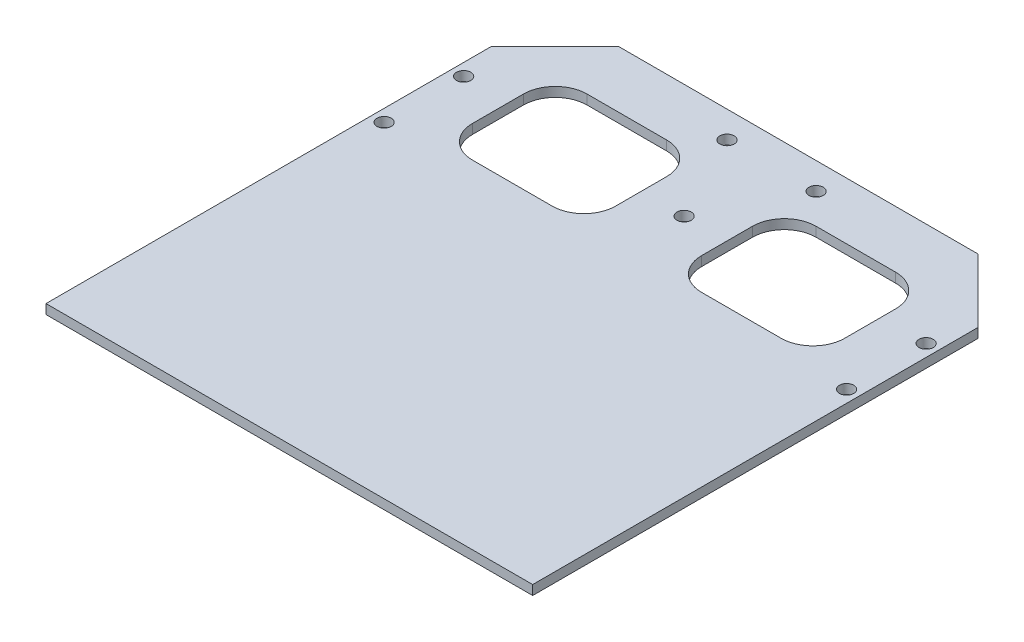
ISO-10303-21;
HEADER;
FILE_DESCRIPTION(('STEP AP214'),'2;1');
FILE_NAME('part.step','',(''),(''),'','','');
FILE_SCHEMA(('AUTOMOTIVE_DESIGN { 1 0 10303 214 1 1 1 1 }'));
ENDSEC;
DATA;
#1=APPLICATION_CONTEXT('core data for automotive mechanical design processes');
#2=APPLICATION_PROTOCOL_DEFINITION('international standard','automotive_design',2000,#1);
#3=PRODUCT_CONTEXT('',#1,'mechanical');
#4=PRODUCT('Part','Part','',(#3));
#5=PRODUCT_RELATED_PRODUCT_CATEGORY('part','',(#4));
#6=PRODUCT_DEFINITION_FORMATION('','',#4);
#7=PRODUCT_DEFINITION_CONTEXT('part definition',#1,'design');
#8=PRODUCT_DEFINITION('design','',#6,#7);
#9=PRODUCT_DEFINITION_SHAPE('','',#8);
#10=(LENGTH_UNIT() NAMED_UNIT(*) SI_UNIT(.MILLI.,.METRE.));
#11=(NAMED_UNIT(*) PLANE_ANGLE_UNIT() SI_UNIT($,.RADIAN.));
#12=(NAMED_UNIT(*) SI_UNIT($,.STERADIAN.) SOLID_ANGLE_UNIT());
#13=UNCERTAINTY_MEASURE_WITH_UNIT(LENGTH_MEASURE(1.E-05),#10,'distance_accuracy_value','');
#14=(GEOMETRIC_REPRESENTATION_CONTEXT(3) GLOBAL_UNCERTAINTY_ASSIGNED_CONTEXT((#13)) GLOBAL_UNIT_ASSIGNED_CONTEXT((#10,
#11,#12)) REPRESENTATION_CONTEXT('',''));
#15=CARTESIAN_POINT('',(0.,0.,0.));
#16=DIRECTION('',(0.,0.,1.));
#17=DIRECTION('',(1.,0.,0.));
#18=AXIS2_PLACEMENT_3D('',#15,#16,#17);
#19=CARTESIAN_POINT('',(76.5,3.,-80.));
#20=DIRECTION('',(-1.,0.,0.));
#21=DIRECTION('',(0.,0.,1.));
#22=AXIS2_PLACEMENT_3D('',#19,#20,#21);
#23=PLANE('',#22);
#24=DIRECTION('',(0.,0.,-1.));
#25=VECTOR('',#24,1.);
#26=CARTESIAN_POINT('',(76.5,0.,-80.));
#27=LINE('',#26,#25);
#28=CARTESIAN_POINT('',(76.5,0.,80.));
#29=VERTEX_POINT('',#28);
#30=CARTESIAN_POINT('',(76.5,0.,-59.9999999999999));
#31=VERTEX_POINT('',#30);
#32=EDGE_CURVE('E222',#29,#31,#27,.T.);
#33=ORIENTED_EDGE('',*,*,#32,.T.);
#34=DIRECTION('',(0.,1.,0.));
#35=VECTOR('',#34,1.);
#36=CARTESIAN_POINT('',(76.5,3.,-59.9999999999999));
#37=LINE('',#36,#35);
#38=CARTESIAN_POINT('',(76.5,3.,-59.9999999999999));
#39=VERTEX_POINT('',#38);
#40=EDGE_CURVE('E66',#31,#39,#37,.T.);
#41=ORIENTED_EDGE('',*,*,#40,.T.);
#42=DIRECTION('',(0.,0.,-1.));
#43=VECTOR('',#42,1.);
#44=CARTESIAN_POINT('',(76.5,3.,-80.));
#45=LINE('',#44,#43);
#46=CARTESIAN_POINT('',(76.5,3.,80.));
#47=VERTEX_POINT('',#46);
#48=EDGE_CURVE('E234',#47,#39,#45,.T.);
#49=ORIENTED_EDGE('',*,*,#48,.F.);
#50=DIRECTION('',(0.,-1.,0.));
#51=VECTOR('',#50,1.);
#52=CARTESIAN_POINT('',(76.5,3.,80.));
#53=LINE('',#52,#51);
#54=EDGE_CURVE('E212',#47,#29,#53,.T.);
#55=ORIENTED_EDGE('',*,*,#54,.T.);
#56=EDGE_LOOP('',(#33,#41,#49,#55));
#57=FACE_BOUND('',#56,.T.);
#58=ADVANCED_FACE('F41',(#57),#23,.F.);
#59=CARTESIAN_POINT('',(-76.5,3.,-80.));
#60=DIRECTION('',(0.,0.,1.));
#61=DIRECTION('',(1.,0.,0.));
#62=AXIS2_PLACEMENT_3D('',#59,#60,#61);
#63=PLANE('',#62);
#64=DIRECTION('',(-1.,0.,0.));
#65=VECTOR('',#64,1.);
#66=CARTESIAN_POINT('',(-76.5,3.,-80.));
#67=LINE('',#66,#65);
#68=CARTESIAN_POINT('',(56.5,3.,-80.));
#69=VERTEX_POINT('',#68);
#70=CARTESIAN_POINT('',(-56.4999999999999,3.,-80.));
#71=VERTEX_POINT('',#70);
#72=EDGE_CURVE('E201',#69,#71,#67,.T.);
#73=ORIENTED_EDGE('',*,*,#72,.F.);
#74=DIRECTION('',(0.,-1.,0.));
#75=VECTOR('',#74,1.);
#76=CARTESIAN_POINT('',(56.5,3.,-80.));
#77=LINE('',#76,#75);
#78=CARTESIAN_POINT('',(56.5,0.,-80.));
#79=VERTEX_POINT('',#78);
#80=EDGE_CURVE('E402',#69,#79,#77,.T.);
#81=ORIENTED_EDGE('',*,*,#80,.T.);
#82=DIRECTION('',(-1.,0.,0.));
#83=VECTOR('',#82,1.);
#84=CARTESIAN_POINT('',(-76.5,0.,-80.));
#85=LINE('',#84,#83);
#86=CARTESIAN_POINT('',(-56.4999999999999,0.,-80.));
#87=VERTEX_POINT('',#86);
#88=EDGE_CURVE('E225',#79,#87,#85,.T.);
#89=ORIENTED_EDGE('',*,*,#88,.T.);
#90=DIRECTION('',(0.,1.,0.));
#91=VECTOR('',#90,1.);
#92=CARTESIAN_POINT('',(-56.4999999999999,3.,-80.));
#93=LINE('',#92,#91);
#94=EDGE_CURVE('E399',#87,#71,#93,.T.);
#95=ORIENTED_EDGE('',*,*,#94,.T.);
#96=EDGE_LOOP('',(#73,#81,#89,#95));
#97=FACE_BOUND('',#96,.T.);
#98=ADVANCED_FACE('F421',(#97),#63,.F.);
#99=CARTESIAN_POINT('',(-76.5,3.,-80.));
#100=DIRECTION('',(1.,0.,0.));
#101=DIRECTION('',(0.,0.,-1.));
#102=AXIS2_PLACEMENT_3D('',#99,#100,#101);
#103=PLANE('',#102);
#104=DIRECTION('',(0.,0.,1.));
#105=VECTOR('',#104,1.);
#106=CARTESIAN_POINT('',(-76.5,3.,-80.));
#107=LINE('',#106,#105);
#108=CARTESIAN_POINT('',(-76.5,3.,-60.));
#109=VERTEX_POINT('',#108);
#110=CARTESIAN_POINT('',(-76.5,3.,80.));
#111=VERTEX_POINT('',#110);
#112=EDGE_CURVE('E192',#109,#111,#107,.T.);
#113=ORIENTED_EDGE('',*,*,#112,.F.);
#114=DIRECTION('',(0.,-1.,0.));
#115=VECTOR('',#114,1.);
#116=CARTESIAN_POINT('',(-76.5,3.,-60.));
#117=LINE('',#116,#115);
#118=CARTESIAN_POINT('',(-76.5,0.,-60.));
#119=VERTEX_POINT('',#118);
#120=EDGE_CURVE('E11',#109,#119,#117,.T.);
#121=ORIENTED_EDGE('',*,*,#120,.T.);
#122=DIRECTION('',(0.,0.,1.));
#123=VECTOR('',#122,1.);
#124=CARTESIAN_POINT('',(-76.5,0.,-80.));
#125=LINE('',#124,#123);
#126=CARTESIAN_POINT('',(-76.5,0.,80.));
#127=VERTEX_POINT('',#126);
#128=EDGE_CURVE('E207',#119,#127,#125,.T.);
#129=ORIENTED_EDGE('',*,*,#128,.T.);
#130=DIRECTION('',(0.,-1.,0.));
#131=VECTOR('',#130,1.);
#132=CARTESIAN_POINT('',(-76.5,3.,80.));
#133=LINE('',#132,#131);
#134=EDGE_CURVE('E204',#111,#127,#133,.T.);
#135=ORIENTED_EDGE('',*,*,#134,.F.);
#136=EDGE_LOOP('',(#113,#121,#129,#135));
#137=FACE_BOUND('',#136,.T.);
#138=ADVANCED_FACE('F205',(#137),#103,.F.);
#139=CARTESIAN_POINT('',(-76.5,3.,80.));
#140=DIRECTION('',(0.,0.,-1.));
#141=DIRECTION('',(-1.,0.,0.));
#142=AXIS2_PLACEMENT_3D('',#139,#140,#141);
#143=PLANE('',#142);
#144=DIRECTION('',(1.,0.,0.));
#145=VECTOR('',#144,1.);
#146=CARTESIAN_POINT('',(-76.5,0.,80.));
#147=LINE('',#146,#145);
#148=EDGE_CURVE('E232',#127,#29,#147,.T.);
#149=ORIENTED_EDGE('',*,*,#148,.T.);
#150=ORIENTED_EDGE('',*,*,#54,.F.);
#151=DIRECTION('',(1.,0.,0.));
#152=VECTOR('',#151,1.);
#153=CARTESIAN_POINT('',(-76.5,3.,80.));
#154=LINE('',#153,#152);
#155=EDGE_CURVE('E196',#111,#47,#154,.T.);
#156=ORIENTED_EDGE('',*,*,#155,.F.);
#157=ORIENTED_EDGE('',*,*,#134,.T.);
#158=EDGE_LOOP('',(#149,#150,#156,#157));
#159=FACE_BOUND('',#158,.T.);
#160=ADVANCED_FACE('F214',(#159),#143,.F.);
#161=CARTESIAN_POINT('',(0.,3.,0.));
#162=DIRECTION('',(0.,1.,0.));
#163=DIRECTION('',(0.,0.,1.));
#164=AXIS2_PLACEMENT_3D('',#161,#162,#163);
#165=PLANE('',#164);
#166=DIRECTION('',(0.,0.,-1.));
#167=VECTOR('',#166,1.);
#168=CARTESIAN_POINT('',(58.5,3.,-62.1));
#169=LINE('',#168,#167);
#170=CARTESIAN_POINT('',(58.5,3.,-36.1));
#171=VERTEX_POINT('',#170);
#172=CARTESIAN_POINT('',(58.5,3.,-52.1));
#173=VERTEX_POINT('',#172);
#174=EDGE_CURVE('E464',#171,#173,#169,.T.);
#175=ORIENTED_EDGE('',*,*,#174,.F.);
#176=CARTESIAN_POINT('',(48.5,3.,-36.1));
#177=DIRECTION('',(0.,1.,0.));
#178=DIRECTION('',(0.,0.,1.));
#179=AXIS2_PLACEMENT_3D('',#176,#177,#178);
#180=CIRCLE('',#179,10.);
#181=CARTESIAN_POINT('',(48.5,3.,-26.1));
#182=VERTEX_POINT('',#181);
#183=EDGE_CURVE('E351',#171,#182,#180,.F.);
#184=ORIENTED_EDGE('',*,*,#183,.T.);
#185=DIRECTION('',(1.,0.,0.));
#186=VECTOR('',#185,1.);
#187=CARTESIAN_POINT('',(13.5,3.,-26.1));
#188=LINE('',#187,#186);
#189=CARTESIAN_POINT('',(23.5,3.,-26.1));
#190=VERTEX_POINT('',#189);
#191=EDGE_CURVE('E456',#190,#182,#188,.T.);
#192=ORIENTED_EDGE('',*,*,#191,.F.);
#193=CARTESIAN_POINT('',(23.5,3.,-36.1));
#194=DIRECTION('',(0.,1.,0.));
#195=DIRECTION('',(0.,0.,1.));
#196=AXIS2_PLACEMENT_3D('',#193,#194,#195);
#197=CIRCLE('',#196,10.);
#198=CARTESIAN_POINT('',(13.5,3.,-36.1));
#199=VERTEX_POINT('',#198);
#200=EDGE_CURVE('E357',#190,#199,#197,.F.);
#201=ORIENTED_EDGE('',*,*,#200,.T.);
#202=DIRECTION('',(0.,0.,1.));
#203=VECTOR('',#202,1.);
#204=CARTESIAN_POINT('',(13.5,3.,-62.1));
#205=LINE('',#204,#203);
#206=CARTESIAN_POINT('',(13.5,3.,-52.1));
#207=VERTEX_POINT('',#206);
#208=EDGE_CURVE('E480',#207,#199,#205,.T.);
#209=ORIENTED_EDGE('',*,*,#208,.F.);
#210=CARTESIAN_POINT('',(23.5,3.,-52.1));
#211=DIRECTION('',(0.,1.,0.));
#212=DIRECTION('',(0.,0.,1.));
#213=AXIS2_PLACEMENT_3D('',#210,#211,#212);
#214=CIRCLE('',#213,10.);
#215=CARTESIAN_POINT('',(23.5,3.,-62.1));
#216=VERTEX_POINT('',#215);
#217=EDGE_CURVE('E363',#207,#216,#214,.F.);
#218=ORIENTED_EDGE('',*,*,#217,.T.);
#219=DIRECTION('',(-1.,0.,0.));
#220=VECTOR('',#219,1.);
#221=CARTESIAN_POINT('',(13.5,3.,-62.1));
#222=LINE('',#221,#220);
#223=CARTESIAN_POINT('',(48.5,3.,-62.1));
#224=VERTEX_POINT('',#223);
#225=EDGE_CURVE('E484',#224,#216,#222,.T.);
#226=ORIENTED_EDGE('',*,*,#225,.F.);
#227=CARTESIAN_POINT('',(48.5,3.,-52.1));
#228=DIRECTION('',(0.,1.,0.));
#229=DIRECTION('',(0.,0.,1.));
#230=AXIS2_PLACEMENT_3D('',#227,#228,#229);
#231=CIRCLE('',#230,10.);
#232=EDGE_CURVE('E369',#224,#173,#231,.F.);
#233=ORIENTED_EDGE('',*,*,#232,.T.);
#234=EDGE_LOOP('',(#175,#184,#192,#201,#209,#218,#226,#233));
#235=FACE_BOUND('',#234,.T.);
#236=DIRECTION('',(-1.,0.,0.));
#237=VECTOR('',#236,1.);
#238=CARTESIAN_POINT('',(-13.5,3.,-62.1));
#239=LINE('',#238,#237);
#240=CARTESIAN_POINT('',(-23.5,3.,-62.1));
#241=VERTEX_POINT('',#240);
#242=CARTESIAN_POINT('',(-48.5,3.,-62.1));
#243=VERTEX_POINT('',#242);
#244=EDGE_CURVE('E473',#241,#243,#239,.T.);
#245=ORIENTED_EDGE('',*,*,#244,.F.);
#246=CARTESIAN_POINT('',(-23.5,3.,-52.1));
#247=DIRECTION('',(0.,1.,0.));
#248=DIRECTION('',(0.,0.,1.));
#249=AXIS2_PLACEMENT_3D('',#246,#247,#248);
#250=CIRCLE('',#249,10.);
#251=CARTESIAN_POINT('',(-13.5,3.,-52.1));
#252=VERTEX_POINT('',#251);
#253=EDGE_CURVE('E393',#241,#252,#250,.F.);
#254=ORIENTED_EDGE('',*,*,#253,.T.);
#255=DIRECTION('',(0.,0.,-1.));
#256=VECTOR('',#255,1.);
#257=CARTESIAN_POINT('',(-13.5,3.,-62.1));
#258=LINE('',#257,#256);
#259=CARTESIAN_POINT('',(-13.5,3.,-36.1));
#260=VERTEX_POINT('',#259);
#261=EDGE_CURVE('E460',#260,#252,#258,.T.);
#262=ORIENTED_EDGE('',*,*,#261,.F.);
#263=CARTESIAN_POINT('',(-23.5,3.,-36.1));
#264=DIRECTION('',(0.,1.,0.));
#265=DIRECTION('',(0.,0.,1.));
#266=AXIS2_PLACEMENT_3D('',#263,#264,#265);
#267=CIRCLE('',#266,10.);
#268=CARTESIAN_POINT('',(-23.5,3.,-26.1));
#269=VERTEX_POINT('',#268);
#270=EDGE_CURVE('E375',#260,#269,#267,.F.);
#271=ORIENTED_EDGE('',*,*,#270,.T.);
#272=DIRECTION('',(1.,0.,0.));
#273=VECTOR('',#272,1.);
#274=CARTESIAN_POINT('',(-13.5,3.,-26.1));
#275=LINE('',#274,#273);
#276=CARTESIAN_POINT('',(-48.5,3.,-26.1));
#277=VERTEX_POINT('',#276);
#278=EDGE_CURVE('E465',#277,#269,#275,.T.);
#279=ORIENTED_EDGE('',*,*,#278,.F.);
#280=CARTESIAN_POINT('',(-48.5,3.,-36.1));
#281=DIRECTION('',(0.,1.,0.));
#282=DIRECTION('',(0.,0.,1.));
#283=AXIS2_PLACEMENT_3D('',#280,#281,#282);
#284=CIRCLE('',#283,10.);
#285=CARTESIAN_POINT('',(-58.5,3.,-36.1));
#286=VERTEX_POINT('',#285);
#287=EDGE_CURVE('E381',#277,#286,#284,.F.);
#288=ORIENTED_EDGE('',*,*,#287,.T.);
#289=DIRECTION('',(0.,0.,1.));
#290=VECTOR('',#289,1.);
#291=CARTESIAN_POINT('',(-58.5,3.,-62.1));
#292=LINE('',#291,#290);
#293=CARTESIAN_POINT('',(-58.5,3.,-52.1));
#294=VERTEX_POINT('',#293);
#295=EDGE_CURVE('E469',#294,#286,#292,.T.);
#296=ORIENTED_EDGE('',*,*,#295,.F.);
#297=CARTESIAN_POINT('',(-48.5,3.,-52.1));
#298=DIRECTION('',(0.,1.,0.));
#299=DIRECTION('',(0.,0.,1.));
#300=AXIS2_PLACEMENT_3D('',#297,#298,#299);
#301=CIRCLE('',#300,10.);
#302=EDGE_CURVE('E387',#294,#243,#301,.F.);
#303=ORIENTED_EDGE('',*,*,#302,.T.);
#304=EDGE_LOOP('',(#245,#254,#262,#271,#279,#288,#296,#303));
#305=FACE_BOUND('',#304,.T.);
#306=CARTESIAN_POINT('',(-14.,3.,-71.6));
#307=DIRECTION('',(0.,1.,0.));
#308=DIRECTION('',(0.,0.,1.));
#309=AXIS2_PLACEMENT_3D('',#306,#307,#308);
#310=CIRCLE('',#309,2.25);
#311=CARTESIAN_POINT('',(-14.,3.,-69.35));
#312=VERTEX_POINT('',#311);
#313=EDGE_CURVE('E444',#312,#312,#310,.T.);
#314=ORIENTED_EDGE('',*,*,#313,.F.);
#315=EDGE_LOOP('',(#314));
#316=FACE_BOUND('',#315,.T.);
#317=CARTESIAN_POINT('',(-72.7,3.,-22.5));
#318=DIRECTION('',(0.,1.,0.));
#319=DIRECTION('',(0.,0.,-1.));
#320=AXIS2_PLACEMENT_3D('',#317,#318,#319);
#321=CIRCLE('',#320,2.25);
#322=CARTESIAN_POINT('',(-72.7,3.,-24.7499999999999));
#323=VERTEX_POINT('',#322);
#324=EDGE_CURVE('E440',#323,#323,#321,.T.);
#325=ORIENTED_EDGE('',*,*,#324,.F.);
#326=EDGE_LOOP('',(#325));
#327=FACE_BOUND('',#326,.T.);
#328=CARTESIAN_POINT('',(72.7,3.,-22.5));
#329=DIRECTION('',(0.,1.,0.));
#330=DIRECTION('',(0.,0.,1.));
#331=AXIS2_PLACEMENT_3D('',#328,#329,#330);
#332=CIRCLE('',#331,2.25);
#333=CARTESIAN_POINT('',(72.7,3.,-20.25));
#334=VERTEX_POINT('',#333);
#335=EDGE_CURVE('E436',#334,#334,#332,.T.);
#336=ORIENTED_EDGE('',*,*,#335,.F.);
#337=EDGE_LOOP('',(#336));
#338=FACE_BOUND('',#337,.T.);
#339=CARTESIAN_POINT('',(-72.7,3.,-47.5));
#340=DIRECTION('',(0.,1.,0.));
#341=DIRECTION('',(0.,0.,-1.));
#342=AXIS2_PLACEMENT_3D('',#339,#340,#341);
#343=CIRCLE('',#342,2.25);
#344=CARTESIAN_POINT('',(-72.7,3.,-49.75));
#345=VERTEX_POINT('',#344);
#346=EDGE_CURVE('E435',#345,#345,#343,.T.);
#347=ORIENTED_EDGE('',*,*,#346,.F.);
#348=EDGE_LOOP('',(#347));
#349=FACE_BOUND('',#348,.T.);
#350=CARTESIAN_POINT('',(14.,3.,-71.6));
#351=DIRECTION('',(0.,1.,0.));
#352=DIRECTION('',(0.,0.,-1.));
#353=AXIS2_PLACEMENT_3D('',#350,#351,#352);
#354=CIRCLE('',#353,2.25);
#355=CARTESIAN_POINT('',(14.,3.,-73.85));
#356=VERTEX_POINT('',#355);
#357=EDGE_CURVE('E448',#356,#356,#354,.T.);
#358=ORIENTED_EDGE('',*,*,#357,.F.);
#359=EDGE_LOOP('',(#358));
#360=FACE_BOUND('',#359,.T.);
#361=CARTESIAN_POINT('',(0.,3.,-44.1));
#362=DIRECTION('',(0.,1.,0.));
#363=DIRECTION('',(0.,0.,1.));
#364=AXIS2_PLACEMENT_3D('',#361,#362,#363);
#365=CIRCLE('',#364,2.25);
#366=CARTESIAN_POINT('',(0.,3.,-41.85));
#367=VERTEX_POINT('',#366);
#368=EDGE_CURVE('E452',#367,#367,#365,.T.);
#369=ORIENTED_EDGE('',*,*,#368,.F.);
#370=EDGE_LOOP('',(#369));
#371=FACE_BOUND('',#370,.T.);
#372=CARTESIAN_POINT('',(72.7,3.,-47.5));
#373=DIRECTION('',(0.,1.,0.));
#374=DIRECTION('',(0.,0.,1.));
#375=AXIS2_PLACEMENT_3D('',#372,#373,#374);
#376=CIRCLE('',#375,2.25);
#377=CARTESIAN_POINT('',(72.7,3.,-45.25));
#378=VERTEX_POINT('',#377);
#379=EDGE_CURVE('E241',#378,#378,#376,.T.);
#380=ORIENTED_EDGE('',*,*,#379,.F.);
#381=EDGE_LOOP('',(#380));
#382=FACE_BOUND('',#381,.T.);
#383=ORIENTED_EDGE('',*,*,#48,.T.);
#384=DIRECTION('',(0.707106781186547,0.,0.707106781186549));
#385=VECTOR('',#384,1.);
#386=CARTESIAN_POINT('',(68.2500000000001,3.,-68.2499999999999));
#387=LINE('',#386,#385);
#388=EDGE_CURVE('E51',#39,#69,#387,.F.);
#389=ORIENTED_EDGE('',*,*,#388,.T.);
#390=ORIENTED_EDGE('',*,*,#72,.T.);
#391=DIRECTION('',(0.707106781186549,0.,-0.707106781186547));
#392=VECTOR('',#391,1.);
#393=CARTESIAN_POINT('',(-68.2499999999999,3.,-68.2500000000001));
#394=LINE('',#393,#392);
#395=EDGE_CURVE('E58',#71,#109,#394,.F.);
#396=ORIENTED_EDGE('',*,*,#395,.T.);
#397=ORIENTED_EDGE('',*,*,#112,.T.);
#398=ORIENTED_EDGE('',*,*,#155,.T.);
#399=EDGE_LOOP('',(#383,#389,#390,#396,#397,#398));
#400=FACE_BOUND('',#399,.T.);
#401=ADVANCED_FACE('F194',(#235,#305,#316,#327,#338,#349,#360,#371,#382,#400),#165,.T.);
#402=CARTESIAN_POINT('',(0.,0.,0.));
#403=DIRECTION('',(0.,1.,0.));
#404=DIRECTION('',(0.,0.,1.));
#405=AXIS2_PLACEMENT_3D('',#402,#403,#404);
#406=PLANE('',#405);
#407=DIRECTION('',(0.,0.,1.));
#408=VECTOR('',#407,1.);
#409=CARTESIAN_POINT('',(13.5,0.,0.));
#410=LINE('',#409,#408);
#411=CARTESIAN_POINT('',(13.5,0.,-52.1));
#412=VERTEX_POINT('',#411);
#413=CARTESIAN_POINT('',(13.5,0.,-36.1));
#414=VERTEX_POINT('',#413);
#415=EDGE_CURVE('E283',#412,#414,#410,.T.);
#416=ORIENTED_EDGE('',*,*,#415,.T.);
#417=CARTESIAN_POINT('',(23.5,0.,-36.1));
#418=DIRECTION('',(0.,1.,0.));
#419=DIRECTION('',(0.,0.,1.));
#420=AXIS2_PLACEMENT_3D('',#417,#418,#419);
#421=CIRCLE('',#420,10.);
#422=CARTESIAN_POINT('',(23.5,0.,-26.1));
#423=VERTEX_POINT('',#422);
#424=EDGE_CURVE('E360',#414,#423,#421,.T.);
#425=ORIENTED_EDGE('',*,*,#424,.T.);
#426=DIRECTION('',(1.,0.,0.));
#427=VECTOR('',#426,1.);
#428=CARTESIAN_POINT('',(0.,0.,-26.1));
#429=LINE('',#428,#427);
#430=CARTESIAN_POINT('',(48.5,0.,-26.1));
#431=VERTEX_POINT('',#430);
#432=EDGE_CURVE('E287',#423,#431,#429,.T.);
#433=ORIENTED_EDGE('',*,*,#432,.T.);
#434=CARTESIAN_POINT('',(48.5,0.,-36.1));
#435=DIRECTION('',(0.,1.,0.));
#436=DIRECTION('',(0.,0.,1.));
#437=AXIS2_PLACEMENT_3D('',#434,#435,#436);
#438=CIRCLE('',#437,10.);
#439=CARTESIAN_POINT('',(58.5,0.,-36.1));
#440=VERTEX_POINT('',#439);
#441=EDGE_CURVE('E354',#431,#440,#438,.T.);
#442=ORIENTED_EDGE('',*,*,#441,.T.);
#443=DIRECTION('',(0.,0.,-1.));
#444=VECTOR('',#443,1.);
#445=CARTESIAN_POINT('',(58.5,0.,0.));
#446=LINE('',#445,#444);
#447=CARTESIAN_POINT('',(58.5,0.,-52.1));
#448=VERTEX_POINT('',#447);
#449=EDGE_CURVE('E291',#440,#448,#446,.T.);
#450=ORIENTED_EDGE('',*,*,#449,.T.);
#451=CARTESIAN_POINT('',(48.5,0.,-52.1));
#452=DIRECTION('',(0.,1.,0.));
#453=DIRECTION('',(0.,0.,1.));
#454=AXIS2_PLACEMENT_3D('',#451,#452,#453);
#455=CIRCLE('',#454,10.);
#456=CARTESIAN_POINT('',(48.5,0.,-62.1));
#457=VERTEX_POINT('',#456);
#458=EDGE_CURVE('E372',#448,#457,#455,.T.);
#459=ORIENTED_EDGE('',*,*,#458,.T.);
#460=DIRECTION('',(-1.,0.,0.));
#461=VECTOR('',#460,1.);
#462=CARTESIAN_POINT('',(0.,0.,-62.1));
#463=LINE('',#462,#461);
#464=CARTESIAN_POINT('',(23.5,0.,-62.1));
#465=VERTEX_POINT('',#464);
#466=EDGE_CURVE('E279',#457,#465,#463,.T.);
#467=ORIENTED_EDGE('',*,*,#466,.T.);
#468=CARTESIAN_POINT('',(23.5,0.,-52.1));
#469=DIRECTION('',(0.,1.,0.));
#470=DIRECTION('',(0.,0.,1.));
#471=AXIS2_PLACEMENT_3D('',#468,#469,#470);
#472=CIRCLE('',#471,10.);
#473=EDGE_CURVE('E366',#465,#412,#472,.T.);
#474=ORIENTED_EDGE('',*,*,#473,.T.);
#475=EDGE_LOOP('',(#416,#425,#433,#442,#450,#459,#467,#474));
#476=FACE_BOUND('',#475,.T.);
#477=DIRECTION('',(1.,0.,0.));
#478=VECTOR('',#477,1.);
#479=CARTESIAN_POINT('',(0.,0.,-26.1));
#480=LINE('',#479,#478);
#481=CARTESIAN_POINT('',(-48.5,0.,-26.1));
#482=VERTEX_POINT('',#481);
#483=CARTESIAN_POINT('',(-23.5,0.,-26.1));
#484=VERTEX_POINT('',#483);
#485=EDGE_CURVE('E267',#482,#484,#480,.T.);
#486=ORIENTED_EDGE('',*,*,#485,.T.);
#487=CARTESIAN_POINT('',(-23.5,0.,-36.1));
#488=DIRECTION('',(0.,1.,0.));
#489=DIRECTION('',(0.,0.,1.));
#490=AXIS2_PLACEMENT_3D('',#487,#488,#489);
#491=CIRCLE('',#490,10.);
#492=CARTESIAN_POINT('',(-13.5,0.,-36.1));
#493=VERTEX_POINT('',#492);
#494=EDGE_CURVE('E378',#484,#493,#491,.T.);
#495=ORIENTED_EDGE('',*,*,#494,.T.);
#496=DIRECTION('',(0.,0.,-1.));
#497=VECTOR('',#496,1.);
#498=CARTESIAN_POINT('',(-13.5,0.,0.));
#499=LINE('',#498,#497);
#500=CARTESIAN_POINT('',(-13.5,0.,-52.1));
#501=VERTEX_POINT('',#500);
#502=EDGE_CURVE('E271',#493,#501,#499,.T.);
#503=ORIENTED_EDGE('',*,*,#502,.T.);
#504=CARTESIAN_POINT('',(-23.5,0.,-52.1));
#505=DIRECTION('',(0.,1.,0.));
#506=DIRECTION('',(0.,0.,1.));
#507=AXIS2_PLACEMENT_3D('',#504,#505,#506);
#508=CIRCLE('',#507,10.);
#509=CARTESIAN_POINT('',(-23.5,0.,-62.1));
#510=VERTEX_POINT('',#509);
#511=EDGE_CURVE('E396',#501,#510,#508,.T.);
#512=ORIENTED_EDGE('',*,*,#511,.T.);
#513=DIRECTION('',(-1.,0.,0.));
#514=VECTOR('',#513,1.);
#515=CARTESIAN_POINT('',(0.,0.,-62.1));
#516=LINE('',#515,#514);
#517=CARTESIAN_POINT('',(-48.5,0.,-62.1));
#518=VERTEX_POINT('',#517);
#519=EDGE_CURVE('E275',#510,#518,#516,.T.);
#520=ORIENTED_EDGE('',*,*,#519,.T.);
#521=CARTESIAN_POINT('',(-48.5,0.,-52.1));
#522=DIRECTION('',(0.,1.,0.));
#523=DIRECTION('',(0.,0.,1.));
#524=AXIS2_PLACEMENT_3D('',#521,#522,#523);
#525=CIRCLE('',#524,10.);
#526=CARTESIAN_POINT('',(-58.5,0.,-52.1));
#527=VERTEX_POINT('',#526);
#528=EDGE_CURVE('E390',#518,#527,#525,.T.);
#529=ORIENTED_EDGE('',*,*,#528,.T.);
#530=DIRECTION('',(0.,0.,1.));
#531=VECTOR('',#530,1.);
#532=CARTESIAN_POINT('',(-58.5,0.,0.));
#533=LINE('',#532,#531);
#534=CARTESIAN_POINT('',(-58.5,0.,-36.1));
#535=VERTEX_POINT('',#534);
#536=EDGE_CURVE('E211',#527,#535,#533,.T.);
#537=ORIENTED_EDGE('',*,*,#536,.T.);
#538=CARTESIAN_POINT('',(-48.5,0.,-36.1));
#539=DIRECTION('',(0.,1.,0.));
#540=DIRECTION('',(0.,0.,1.));
#541=AXIS2_PLACEMENT_3D('',#538,#539,#540);
#542=CIRCLE('',#541,10.);
#543=EDGE_CURVE('E384',#535,#482,#542,.T.);
#544=ORIENTED_EDGE('',*,*,#543,.T.);
#545=EDGE_LOOP('',(#486,#495,#503,#512,#520,#529,#537,#544));
#546=FACE_BOUND('',#545,.T.);
#547=CARTESIAN_POINT('',(-14.,0.,-71.6));
#548=DIRECTION('',(0.,1.,0.));
#549=DIRECTION('',(0.,0.,1.));
#550=AXIS2_PLACEMENT_3D('',#547,#548,#549);
#551=CIRCLE('',#550,2.25);
#552=CARTESIAN_POINT('',(-14.,0.,-69.35));
#553=VERTEX_POINT('',#552);
#554=EDGE_CURVE('E226',#553,#553,#551,.T.);
#555=ORIENTED_EDGE('',*,*,#554,.T.);
#556=EDGE_LOOP('',(#555));
#557=FACE_BOUND('',#556,.T.);
#558=CARTESIAN_POINT('',(-72.7,0.,-22.5));
#559=DIRECTION('',(0.,1.,0.));
#560=DIRECTION('',(0.,0.,1.));
#561=AXIS2_PLACEMENT_3D('',#558,#559,#560);
#562=CIRCLE('',#561,2.25);
#563=CARTESIAN_POINT('',(-72.7,0.,-20.25));
#564=VERTEX_POINT('',#563);
#565=EDGE_CURVE('E257',#564,#564,#562,.T.);
#566=ORIENTED_EDGE('',*,*,#565,.T.);
#567=EDGE_LOOP('',(#566));
#568=FACE_BOUND('',#567,.T.);
#569=CARTESIAN_POINT('',(72.7,0.,-22.5));
#570=DIRECTION('',(0.,1.,0.));
#571=DIRECTION('',(0.,0.,1.));
#572=AXIS2_PLACEMENT_3D('',#569,#570,#571);
#573=CIRCLE('',#572,2.25);
#574=CARTESIAN_POINT('',(72.7,0.,-20.25));
#575=VERTEX_POINT('',#574);
#576=EDGE_CURVE('E253',#575,#575,#573,.T.);
#577=ORIENTED_EDGE('',*,*,#576,.T.);
#578=EDGE_LOOP('',(#577));
#579=FACE_BOUND('',#578,.T.);
#580=CARTESIAN_POINT('',(-72.7,0.,-47.5));
#581=DIRECTION('',(0.,1.,0.));
#582=DIRECTION('',(0.,0.,1.));
#583=AXIS2_PLACEMENT_3D('',#580,#581,#582);
#584=CIRCLE('',#583,2.25);
#585=CARTESIAN_POINT('',(-72.7,0.,-45.2500000000001));
#586=VERTEX_POINT('',#585);
#587=EDGE_CURVE('E249',#586,#586,#584,.T.);
#588=ORIENTED_EDGE('',*,*,#587,.T.);
#589=EDGE_LOOP('',(#588));
#590=FACE_BOUND('',#589,.T.);
#591=CARTESIAN_POINT('',(14.,0.,-71.6));
#592=DIRECTION('',(0.,1.,0.));
#593=DIRECTION('',(0.,0.,1.));
#594=AXIS2_PLACEMENT_3D('',#591,#592,#593);
#595=CIRCLE('',#594,2.25);
#596=CARTESIAN_POINT('',(14.,0.,-69.35));
#597=VERTEX_POINT('',#596);
#598=EDGE_CURVE('E245',#597,#597,#595,.T.);
#599=ORIENTED_EDGE('',*,*,#598,.T.);
#600=EDGE_LOOP('',(#599));
#601=FACE_BOUND('',#600,.T.);
#602=CARTESIAN_POINT('',(0.,0.,-44.1));
#603=DIRECTION('',(0.,1.,0.));
#604=DIRECTION('',(0.,0.,1.));
#605=AXIS2_PLACEMENT_3D('',#602,#603,#604);
#606=CIRCLE('',#605,2.25);
#607=CARTESIAN_POINT('',(0.,0.,-41.85));
#608=VERTEX_POINT('',#607);
#609=EDGE_CURVE('E240',#608,#608,#606,.T.);
#610=ORIENTED_EDGE('',*,*,#609,.T.);
#611=EDGE_LOOP('',(#610));
#612=FACE_BOUND('',#611,.T.);
#613=CARTESIAN_POINT('',(72.7,0.,-47.5));
#614=DIRECTION('',(0.,1.,0.));
#615=DIRECTION('',(0.,0.,1.));
#616=AXIS2_PLACEMENT_3D('',#613,#614,#615);
#617=CIRCLE('',#616,2.25);
#618=CARTESIAN_POINT('',(72.7,0.,-45.25));
#619=VERTEX_POINT('',#618);
#620=EDGE_CURVE('E236',#619,#619,#617,.T.);
#621=ORIENTED_EDGE('',*,*,#620,.T.);
#622=EDGE_LOOP('',(#621));
#623=FACE_BOUND('',#622,.T.);
#624=ORIENTED_EDGE('',*,*,#88,.F.);
#625=DIRECTION('',(-0.707106781186547,0.,-0.707106781186549));
#626=VECTOR('',#625,1.);
#627=CARTESIAN_POINT('',(56.5,0.,-80.));
#628=LINE('',#627,#626);
#629=EDGE_CURVE('E409',#79,#31,#628,.F.);
#630=ORIENTED_EDGE('',*,*,#629,.T.);
#631=ORIENTED_EDGE('',*,*,#32,.F.);
#632=ORIENTED_EDGE('',*,*,#148,.F.);
#633=ORIENTED_EDGE('',*,*,#128,.F.);
#634=DIRECTION('',(-0.707106781186549,0.,0.707106781186547));
#635=VECTOR('',#634,1.);
#636=CARTESIAN_POINT('',(-76.5,0.,-60.));
#637=LINE('',#636,#635);
#638=EDGE_CURVE('E406',#119,#87,#637,.F.);
#639=ORIENTED_EDGE('',*,*,#638,.T.);
#640=EDGE_LOOP('',(#624,#630,#631,#632,#633,#639));
#641=FACE_BOUND('',#640,.T.);
#642=ADVANCED_FACE('F428',(#476,#546,#557,#568,#579,#590,#601,#612,#623,#641),#406,.F.);
#643=CARTESIAN_POINT('',(72.7,-2.,-47.5));
#644=DIRECTION('',(0.,1.,0.));
#645=DIRECTION('',(0.,0.,1.));
#646=AXIS2_PLACEMENT_3D('',#643,#644,#645);
#647=CYLINDRICAL_SURFACE('',#646,2.25);
#648=ORIENTED_EDGE('',*,*,#379,.T.);
#649=EDGE_LOOP('',(#648));
#650=FACE_BOUND('',#649,.T.);
#651=ORIENTED_EDGE('',*,*,#620,.F.);
#652=EDGE_LOOP('',(#651));
#653=FACE_BOUND('',#652,.T.);
#654=ADVANCED_FACE('F548',(#650,#653),#647,.F.);
#655=CARTESIAN_POINT('',(0.,-2.,-44.1));
#656=DIRECTION('',(0.,1.,0.));
#657=DIRECTION('',(0.,0.,1.));
#658=AXIS2_PLACEMENT_3D('',#655,#656,#657);
#659=CYLINDRICAL_SURFACE('',#658,2.25);
#660=ORIENTED_EDGE('',*,*,#368,.T.);
#661=EDGE_LOOP('',(#660));
#662=FACE_BOUND('',#661,.T.);
#663=ORIENTED_EDGE('',*,*,#609,.F.);
#664=EDGE_LOOP('',(#663));
#665=FACE_BOUND('',#664,.T.);
#666=ADVANCED_FACE('F551',(#662,#665),#659,.F.);
#667=CARTESIAN_POINT('',(14.,-2.,-71.6));
#668=DIRECTION('',(0.,1.,0.));
#669=DIRECTION('',(0.,0.,1.));
#670=AXIS2_PLACEMENT_3D('',#667,#668,#669);
#671=CYLINDRICAL_SURFACE('',#670,2.25);
#672=ORIENTED_EDGE('',*,*,#357,.T.);
#673=EDGE_LOOP('',(#672));
#674=FACE_BOUND('',#673,.T.);
#675=ORIENTED_EDGE('',*,*,#598,.F.);
#676=EDGE_LOOP('',(#675));
#677=FACE_BOUND('',#676,.T.);
#678=ADVANCED_FACE('F795',(#674,#677),#671,.F.);
#679=CARTESIAN_POINT('',(-72.7,-2.,-47.5));
#680=DIRECTION('',(0.,1.,0.));
#681=DIRECTION('',(0.,0.,1.));
#682=AXIS2_PLACEMENT_3D('',#679,#680,#681);
#683=CYLINDRICAL_SURFACE('',#682,2.25);
#684=ORIENTED_EDGE('',*,*,#346,.T.);
#685=EDGE_LOOP('',(#684));
#686=FACE_BOUND('',#685,.T.);
#687=ORIENTED_EDGE('',*,*,#587,.F.);
#688=EDGE_LOOP('',(#687));
#689=FACE_BOUND('',#688,.T.);
#690=ADVANCED_FACE('F785',(#686,#689),#683,.F.);
#691=CARTESIAN_POINT('',(72.7,-2.,-22.5));
#692=DIRECTION('',(0.,1.,0.));
#693=DIRECTION('',(0.,0.,1.));
#694=AXIS2_PLACEMENT_3D('',#691,#692,#693);
#695=CYLINDRICAL_SURFACE('',#694,2.25);
#696=ORIENTED_EDGE('',*,*,#335,.T.);
#697=EDGE_LOOP('',(#696));
#698=FACE_BOUND('',#697,.T.);
#699=ORIENTED_EDGE('',*,*,#576,.F.);
#700=EDGE_LOOP('',(#699));
#701=FACE_BOUND('',#700,.T.);
#702=ADVANCED_FACE('F775',(#698,#701),#695,.F.);
#703=CARTESIAN_POINT('',(-72.7,-2.,-22.5));
#704=DIRECTION('',(0.,1.,0.));
#705=DIRECTION('',(0.,0.,1.));
#706=AXIS2_PLACEMENT_3D('',#703,#704,#705);
#707=CYLINDRICAL_SURFACE('',#706,2.25);
#708=ORIENTED_EDGE('',*,*,#324,.T.);
#709=EDGE_LOOP('',(#708));
#710=FACE_BOUND('',#709,.T.);
#711=ORIENTED_EDGE('',*,*,#565,.F.);
#712=EDGE_LOOP('',(#711));
#713=FACE_BOUND('',#712,.T.);
#714=ADVANCED_FACE('F765',(#710,#713),#707,.F.);
#715=CARTESIAN_POINT('',(-14.,-2.,-71.6));
#716=DIRECTION('',(0.,1.,0.));
#717=DIRECTION('',(0.,0.,1.));
#718=AXIS2_PLACEMENT_3D('',#715,#716,#717);
#719=CYLINDRICAL_SURFACE('',#718,2.25);
#720=ORIENTED_EDGE('',*,*,#313,.T.);
#721=EDGE_LOOP('',(#720));
#722=FACE_BOUND('',#721,.T.);
#723=ORIENTED_EDGE('',*,*,#554,.F.);
#724=EDGE_LOOP('',(#723));
#725=FACE_BOUND('',#724,.T.);
#726=ADVANCED_FACE('F755',(#722,#725),#719,.F.);
#727=CARTESIAN_POINT('',(-13.5,-2.,-62.1));
#728=DIRECTION('',(0.,0.,-1.));
#729=DIRECTION('',(-1.,0.,0.));
#730=AXIS2_PLACEMENT_3D('',#727,#728,#729);
#731=PLANE('',#730);
#732=ORIENTED_EDGE('',*,*,#244,.T.);
#733=DIRECTION('',(0.,1.,0.));
#734=VECTOR('',#733,1.);
#735=CARTESIAN_POINT('',(-48.5,0.,-62.1));
#736=LINE('',#735,#734);
#737=EDGE_CURVE('E348',#243,#518,#736,.F.);
#738=ORIENTED_EDGE('',*,*,#737,.T.);
#739=ORIENTED_EDGE('',*,*,#519,.F.);
#740=DIRECTION('',(0.,1.,0.));
#741=VECTOR('',#740,1.);
#742=CARTESIAN_POINT('',(-23.5,3.,-62.1));
#743=LINE('',#742,#741);
#744=EDGE_CURVE('E344',#510,#241,#743,.T.);
#745=ORIENTED_EDGE('',*,*,#744,.T.);
#746=EDGE_LOOP('',(#732,#738,#739,#745));
#747=FACE_BOUND('',#746,.T.);
#748=ADVANCED_FACE('F745',(#747),#731,.F.);
#749=CARTESIAN_POINT('',(-13.5,-2.,-62.1));
#750=DIRECTION('',(1.,0.,0.));
#751=DIRECTION('',(0.,0.,-1.));
#752=AXIS2_PLACEMENT_3D('',#749,#750,#751);
#753=PLANE('',#752);
#754=ORIENTED_EDGE('',*,*,#502,.F.);
#755=DIRECTION('',(0.,1.,0.));
#756=VECTOR('',#755,1.);
#757=CARTESIAN_POINT('',(-13.5,3.,-36.1));
#758=LINE('',#757,#756);
#759=EDGE_CURVE('E326',#493,#260,#758,.T.);
#760=ORIENTED_EDGE('',*,*,#759,.T.);
#761=ORIENTED_EDGE('',*,*,#261,.T.);
#762=DIRECTION('',(0.,1.,0.));
#763=VECTOR('',#762,1.);
#764=CARTESIAN_POINT('',(-13.5,0.,-52.1));
#765=LINE('',#764,#763);
#766=EDGE_CURVE('E323',#252,#501,#765,.F.);
#767=ORIENTED_EDGE('',*,*,#766,.T.);
#768=EDGE_LOOP('',(#754,#760,#761,#767));
#769=FACE_BOUND('',#768,.T.);
#770=ADVANCED_FACE('F735',(#769),#753,.F.);
#771=CARTESIAN_POINT('',(-13.5,-2.,-26.1));
#772=DIRECTION('',(0.,0.,1.));
#773=DIRECTION('',(1.,0.,0.));
#774=AXIS2_PLACEMENT_3D('',#771,#772,#773);
#775=PLANE('',#774);
#776=ORIENTED_EDGE('',*,*,#278,.T.);
#777=DIRECTION('',(0.,1.,0.));
#778=VECTOR('',#777,1.);
#779=CARTESIAN_POINT('',(-23.5,0.,-26.1));
#780=LINE('',#779,#778);
#781=EDGE_CURVE('E334',#269,#484,#780,.F.);
#782=ORIENTED_EDGE('',*,*,#781,.T.);
#783=ORIENTED_EDGE('',*,*,#485,.F.);
#784=DIRECTION('',(0.,1.,0.));
#785=VECTOR('',#784,1.);
#786=CARTESIAN_POINT('',(-48.5,3.,-26.1));
#787=LINE('',#786,#785);
#788=EDGE_CURVE('E330',#482,#277,#787,.T.);
#789=ORIENTED_EDGE('',*,*,#788,.T.);
#790=EDGE_LOOP('',(#776,#782,#783,#789));
#791=FACE_BOUND('',#790,.T.);
#792=ADVANCED_FACE('F725',(#791),#775,.F.);
#793=CARTESIAN_POINT('',(-58.5,-2.,-62.1));
#794=DIRECTION('',(-1.,0.,0.));
#795=DIRECTION('',(0.,0.,1.));
#796=AXIS2_PLACEMENT_3D('',#793,#794,#795);
#797=PLANE('',#796);
#798=ORIENTED_EDGE('',*,*,#295,.T.);
#799=DIRECTION('',(0.,1.,0.));
#800=VECTOR('',#799,1.);
#801=CARTESIAN_POINT('',(-58.5,0.,-36.1));
#802=LINE('',#801,#800);
#803=EDGE_CURVE('E341',#286,#535,#802,.F.);
#804=ORIENTED_EDGE('',*,*,#803,.T.);
#805=ORIENTED_EDGE('',*,*,#536,.F.);
#806=DIRECTION('',(0.,1.,0.));
#807=VECTOR('',#806,1.);
#808=CARTESIAN_POINT('',(-58.5,3.,-52.1));
#809=LINE('',#808,#807);
#810=EDGE_CURVE('E337',#527,#294,#809,.T.);
#811=ORIENTED_EDGE('',*,*,#810,.T.);
#812=EDGE_LOOP('',(#798,#804,#805,#811));
#813=FACE_BOUND('',#812,.T.);
#814=ADVANCED_FACE('F716',(#813),#797,.F.);
#815=CARTESIAN_POINT('',(58.5,-2.,-62.1));
#816=DIRECTION('',(1.,0.,0.));
#817=DIRECTION('',(0.,0.,-1.));
#818=AXIS2_PLACEMENT_3D('',#815,#816,#817);
#819=PLANE('',#818);
#820=ORIENTED_EDGE('',*,*,#449,.F.);
#821=DIRECTION('',(0.,1.,0.));
#822=VECTOR('',#821,1.);
#823=CARTESIAN_POINT('',(58.5,3.,-36.1));
#824=LINE('',#823,#822);
#825=EDGE_CURVE('E298',#440,#171,#824,.T.);
#826=ORIENTED_EDGE('',*,*,#825,.T.);
#827=ORIENTED_EDGE('',*,*,#174,.T.);
#828=DIRECTION('',(0.,1.,0.));
#829=VECTOR('',#828,1.);
#830=CARTESIAN_POINT('',(58.5,0.,-52.1));
#831=LINE('',#830,#829);
#832=EDGE_CURVE('E295',#173,#448,#831,.F.);
#833=ORIENTED_EDGE('',*,*,#832,.T.);
#834=EDGE_LOOP('',(#820,#826,#827,#833));
#835=FACE_BOUND('',#834,.T.);
#836=ADVANCED_FACE('F494',(#835),#819,.F.);
#837=CARTESIAN_POINT('',(13.5,-2.,-26.1));
#838=DIRECTION('',(0.,0.,1.));
#839=DIRECTION('',(1.,0.,0.));
#840=AXIS2_PLACEMENT_3D('',#837,#838,#839);
#841=PLANE('',#840);
#842=ORIENTED_EDGE('',*,*,#191,.T.);
#843=DIRECTION('',(0.,1.,0.));
#844=VECTOR('',#843,1.);
#845=CARTESIAN_POINT('',(48.5,0.,-26.1));
#846=LINE('',#845,#844);
#847=EDGE_CURVE('E306',#182,#431,#846,.F.);
#848=ORIENTED_EDGE('',*,*,#847,.T.);
#849=ORIENTED_EDGE('',*,*,#432,.F.);
#850=DIRECTION('',(0.,1.,0.));
#851=VECTOR('',#850,1.);
#852=CARTESIAN_POINT('',(23.5,3.,-26.1));
#853=LINE('',#852,#851);
#854=EDGE_CURVE('E302',#423,#190,#853,.T.);
#855=ORIENTED_EDGE('',*,*,#854,.T.);
#856=EDGE_LOOP('',(#842,#848,#849,#855));
#857=FACE_BOUND('',#856,.T.);
#858=ADVANCED_FACE('F524',(#857),#841,.F.);
#859=CARTESIAN_POINT('',(13.5,-2.,-62.1));
#860=DIRECTION('',(-1.,0.,0.));
#861=DIRECTION('',(0.,0.,1.));
#862=AXIS2_PLACEMENT_3D('',#859,#860,#861);
#863=PLANE('',#862);
#864=ORIENTED_EDGE('',*,*,#208,.T.);
#865=DIRECTION('',(0.,1.,0.));
#866=VECTOR('',#865,1.);
#867=CARTESIAN_POINT('',(13.5,0.,-36.1));
#868=LINE('',#867,#866);
#869=EDGE_CURVE('E313',#199,#414,#868,.F.);
#870=ORIENTED_EDGE('',*,*,#869,.T.);
#871=ORIENTED_EDGE('',*,*,#415,.F.);
#872=DIRECTION('',(0.,1.,0.));
#873=VECTOR('',#872,1.);
#874=CARTESIAN_POINT('',(13.5,3.,-52.1));
#875=LINE('',#874,#873);
#876=EDGE_CURVE('E309',#412,#207,#875,.T.);
#877=ORIENTED_EDGE('',*,*,#876,.T.);
#878=EDGE_LOOP('',(#864,#870,#871,#877));
#879=FACE_BOUND('',#878,.T.);
#880=ADVANCED_FACE('F515',(#879),#863,.F.);
#881=CARTESIAN_POINT('',(13.5,-2.,-62.1));
#882=DIRECTION('',(0.,0.,-1.));
#883=DIRECTION('',(-1.,0.,0.));
#884=AXIS2_PLACEMENT_3D('',#881,#882,#883);
#885=PLANE('',#884);
#886=ORIENTED_EDGE('',*,*,#225,.T.);
#887=DIRECTION('',(0.,1.,0.));
#888=VECTOR('',#887,1.);
#889=CARTESIAN_POINT('',(23.5,0.,-62.1));
#890=LINE('',#889,#888);
#891=EDGE_CURVE('E320',#216,#465,#890,.F.);
#892=ORIENTED_EDGE('',*,*,#891,.T.);
#893=ORIENTED_EDGE('',*,*,#466,.F.);
#894=DIRECTION('',(0.,1.,0.));
#895=VECTOR('',#894,1.);
#896=CARTESIAN_POINT('',(48.5,3.,-62.1));
#897=LINE('',#896,#895);
#898=EDGE_CURVE('E316',#457,#224,#897,.T.);
#899=ORIENTED_EDGE('',*,*,#898,.T.);
#900=EDGE_LOOP('',(#886,#892,#893,#899));
#901=FACE_BOUND('',#900,.T.);
#902=ADVANCED_FACE('F506',(#901),#885,.F.);
#903=CARTESIAN_POINT('',(48.5,-2.,-36.1));
#904=DIRECTION('',(0.,-1.,0.));
#905=DIRECTION('',(0.,0.,-1.));
#906=AXIS2_PLACEMENT_3D('',#903,#904,#905);
#907=CYLINDRICAL_SURFACE('',#906,10.);
#908=ORIENTED_EDGE('',*,*,#441,.F.);
#909=ORIENTED_EDGE('',*,*,#847,.F.);
#910=ORIENTED_EDGE('',*,*,#183,.F.);
#911=ORIENTED_EDGE('',*,*,#825,.F.);
#912=EDGE_LOOP('',(#908,#909,#910,#911));
#913=FACE_BOUND('',#912,.T.);
#914=ADVANCED_FACE('F528',(#913),#907,.F.);
#915=CARTESIAN_POINT('',(23.5,-2.,-36.1));
#916=DIRECTION('',(0.,-1.,0.));
#917=DIRECTION('',(0.,0.,-1.));
#918=AXIS2_PLACEMENT_3D('',#915,#916,#917);
#919=CYLINDRICAL_SURFACE('',#918,10.);
#920=ORIENTED_EDGE('',*,*,#424,.F.);
#921=ORIENTED_EDGE('',*,*,#869,.F.);
#922=ORIENTED_EDGE('',*,*,#200,.F.);
#923=ORIENTED_EDGE('',*,*,#854,.F.);
#924=EDGE_LOOP('',(#920,#921,#922,#923));
#925=FACE_BOUND('',#924,.T.);
#926=ADVANCED_FACE('F519',(#925),#919,.F.);
#927=CARTESIAN_POINT('',(23.5,-2.,-52.1));
#928=DIRECTION('',(0.,-1.,0.));
#929=DIRECTION('',(0.,0.,-1.));
#930=AXIS2_PLACEMENT_3D('',#927,#928,#929);
#931=CYLINDRICAL_SURFACE('',#930,10.);
#932=ORIENTED_EDGE('',*,*,#473,.F.);
#933=ORIENTED_EDGE('',*,*,#891,.F.);
#934=ORIENTED_EDGE('',*,*,#217,.F.);
#935=ORIENTED_EDGE('',*,*,#876,.F.);
#936=EDGE_LOOP('',(#932,#933,#934,#935));
#937=FACE_BOUND('',#936,.T.);
#938=ADVANCED_FACE('F510',(#937),#931,.F.);
#939=CARTESIAN_POINT('',(48.5,-2.,-52.1));
#940=DIRECTION('',(0.,-1.,0.));
#941=DIRECTION('',(0.,0.,-1.));
#942=AXIS2_PLACEMENT_3D('',#939,#940,#941);
#943=CYLINDRICAL_SURFACE('',#942,10.);
#944=ORIENTED_EDGE('',*,*,#458,.F.);
#945=ORIENTED_EDGE('',*,*,#832,.F.);
#946=ORIENTED_EDGE('',*,*,#232,.F.);
#947=ORIENTED_EDGE('',*,*,#898,.F.);
#948=EDGE_LOOP('',(#944,#945,#946,#947));
#949=FACE_BOUND('',#948,.T.);
#950=ADVANCED_FACE('F499',(#949),#943,.F.);
#951=CARTESIAN_POINT('',(-23.5,-2.,-36.1));
#952=DIRECTION('',(0.,-1.,0.));
#953=DIRECTION('',(0.,0.,-1.));
#954=AXIS2_PLACEMENT_3D('',#951,#952,#953);
#955=CYLINDRICAL_SURFACE('',#954,10.);
#956=ORIENTED_EDGE('',*,*,#494,.F.);
#957=ORIENTED_EDGE('',*,*,#781,.F.);
#958=ORIENTED_EDGE('',*,*,#270,.F.);
#959=ORIENTED_EDGE('',*,*,#759,.F.);
#960=EDGE_LOOP('',(#956,#957,#958,#959));
#961=FACE_BOUND('',#960,.T.);
#962=ADVANCED_FACE('F576',(#961),#955,.F.);
#963=CARTESIAN_POINT('',(-48.5,-2.,-36.1));
#964=DIRECTION('',(0.,-1.,0.));
#965=DIRECTION('',(0.,0.,-1.));
#966=AXIS2_PLACEMENT_3D('',#963,#964,#965);
#967=CYLINDRICAL_SURFACE('',#966,10.);
#968=ORIENTED_EDGE('',*,*,#543,.F.);
#969=ORIENTED_EDGE('',*,*,#803,.F.);
#970=ORIENTED_EDGE('',*,*,#287,.F.);
#971=ORIENTED_EDGE('',*,*,#788,.F.);
#972=EDGE_LOOP('',(#968,#969,#970,#971));
#973=FACE_BOUND('',#972,.T.);
#974=ADVANCED_FACE('F579',(#973),#967,.F.);
#975=CARTESIAN_POINT('',(-48.5,-2.,-52.1));
#976=DIRECTION('',(0.,-1.,0.));
#977=DIRECTION('',(0.,0.,-1.));
#978=AXIS2_PLACEMENT_3D('',#975,#976,#977);
#979=CYLINDRICAL_SURFACE('',#978,10.);
#980=ORIENTED_EDGE('',*,*,#528,.F.);
#981=ORIENTED_EDGE('',*,*,#737,.F.);
#982=ORIENTED_EDGE('',*,*,#302,.F.);
#983=ORIENTED_EDGE('',*,*,#810,.F.);
#984=EDGE_LOOP('',(#980,#981,#982,#983));
#985=FACE_BOUND('',#984,.T.);
#986=ADVANCED_FACE('F583',(#985),#979,.F.);
#987=CARTESIAN_POINT('',(-23.5,-2.,-52.1));
#988=DIRECTION('',(0.,-1.,0.));
#989=DIRECTION('',(0.,0.,-1.));
#990=AXIS2_PLACEMENT_3D('',#987,#988,#989);
#991=CYLINDRICAL_SURFACE('',#990,10.);
#992=ORIENTED_EDGE('',*,*,#511,.F.);
#993=ORIENTED_EDGE('',*,*,#766,.F.);
#994=ORIENTED_EDGE('',*,*,#253,.F.);
#995=ORIENTED_EDGE('',*,*,#744,.F.);
#996=EDGE_LOOP('',(#992,#993,#994,#995));
#997=FACE_BOUND('',#996,.T.);
#998=ADVANCED_FACE('F587',(#997),#991,.F.);
#999=CARTESIAN_POINT('',(56.5,3.,-80.));
#1000=DIRECTION('',(-0.707106781186549,0.,0.707106781186547));
#1001=DIRECTION('',(0.,-1.,0.));
#1002=AXIS2_PLACEMENT_3D('',#999,#1000,#1001);
#1003=PLANE('',#1002);
#1004=ORIENTED_EDGE('',*,*,#388,.F.);
#1005=ORIENTED_EDGE('',*,*,#40,.F.);
#1006=ORIENTED_EDGE('',*,*,#629,.F.);
#1007=ORIENTED_EDGE('',*,*,#80,.F.);
#1008=EDGE_LOOP('',(#1004,#1005,#1006,#1007));
#1009=FACE_BOUND('',#1008,.T.);
#1010=ADVANCED_FACE('F425',(#1009),#1003,.F.);
#1011=CARTESIAN_POINT('',(-76.5,3.,-60.));
#1012=DIRECTION('',(0.707106781186547,0.,0.707106781186549));
#1013=DIRECTION('',(0.,-1.,0.));
#1014=AXIS2_PLACEMENT_3D('',#1011,#1012,#1013);
#1015=PLANE('',#1014);
#1016=ORIENTED_EDGE('',*,*,#395,.F.);
#1017=ORIENTED_EDGE('',*,*,#94,.F.);
#1018=ORIENTED_EDGE('',*,*,#638,.F.);
#1019=ORIENTED_EDGE('',*,*,#120,.F.);
#1020=EDGE_LOOP('',(#1016,#1017,#1018,#1019));
#1021=FACE_BOUND('',#1020,.T.);
#1022=ADVANCED_FACE('F44',(#1021),#1015,.F.);
#1023=CLOSED_SHELL('',(#58,#98,#138,#160,#401,#642,#654,#666,#678,#690,#702,#714,#726,#748,#770,
#792,#814,#836,#858,#880,#902,#914,#926,#938,#950,#962,#974,#986,#998,#1010,#1022));
#1024=MANIFOLD_SOLID_BREP('B2',#1023);
#1025=ADVANCED_BREP_SHAPE_REPRESENTATION('',(#18,#1024),#14);
#1026=SHAPE_DEFINITION_REPRESENTATION(#9,#1025);
ENDSEC;
END-ISO-10303-21;
